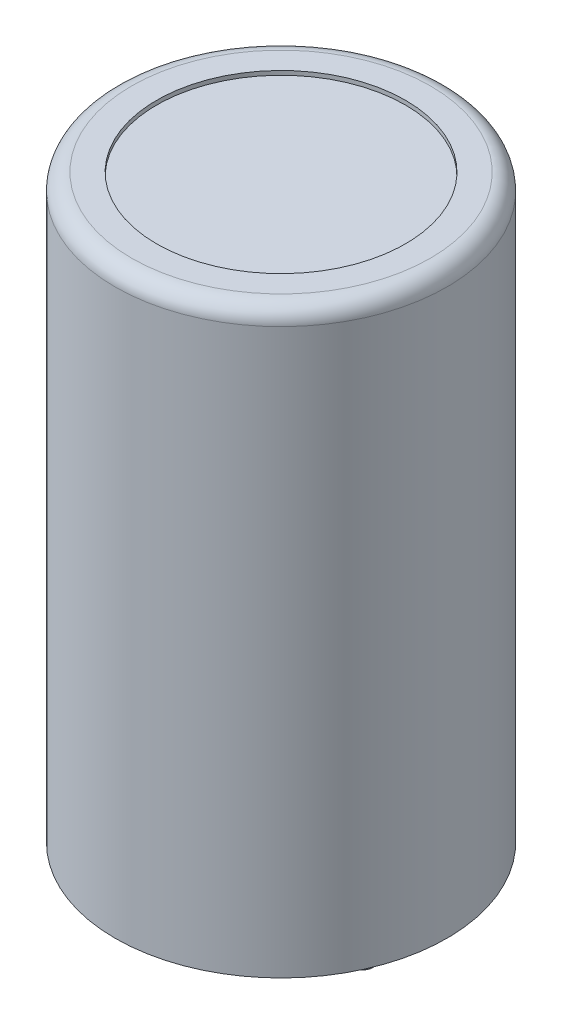
ISO-10303-21;
HEADER;
FILE_DESCRIPTION(('STEP AP214'),'2;1');
FILE_NAME('part.step','',(''),(''),'','','');
FILE_SCHEMA(('AUTOMOTIVE_DESIGN { 1 0 10303 214 1 1 1 1 }'));
ENDSEC;
DATA;
#1=APPLICATION_CONTEXT('core data for automotive mechanical design processes');
#2=APPLICATION_PROTOCOL_DEFINITION('international standard','automotive_design',2000,#1);
#3=PRODUCT_CONTEXT('',#1,'mechanical');
#4=PRODUCT('Part','Part','',(#3));
#5=PRODUCT_RELATED_PRODUCT_CATEGORY('part','',(#4));
#6=PRODUCT_DEFINITION_FORMATION('','',#4);
#7=PRODUCT_DEFINITION_CONTEXT('part definition',#1,'design');
#8=PRODUCT_DEFINITION('design','',#6,#7);
#9=PRODUCT_DEFINITION_SHAPE('','',#8);
#10=(LENGTH_UNIT() NAMED_UNIT(*) SI_UNIT(.MILLI.,.METRE.));
#11=(NAMED_UNIT(*) PLANE_ANGLE_UNIT() SI_UNIT($,.RADIAN.));
#12=(NAMED_UNIT(*) SI_UNIT($,.STERADIAN.) SOLID_ANGLE_UNIT());
#13=UNCERTAINTY_MEASURE_WITH_UNIT(LENGTH_MEASURE(1.E-05),#10,'distance_accuracy_value','');
#14=(GEOMETRIC_REPRESENTATION_CONTEXT(3) GLOBAL_UNCERTAINTY_ASSIGNED_CONTEXT((#13)) GLOBAL_UNIT_ASSIGNED_CONTEXT((#10,
#11,#12)) REPRESENTATION_CONTEXT('',''));
#15=CARTESIAN_POINT('',(0.,0.,0.));
#16=DIRECTION('',(0.,0.,1.));
#17=DIRECTION('',(1.,0.,0.));
#18=AXIS2_PLACEMENT_3D('',#15,#16,#17);
#19=CARTESIAN_POINT('',(0.,17.78,0.));
#20=DIRECTION('',(0.,-1.,0.));
#21=DIRECTION('',(0.,0.,-1.));
#22=AXIS2_PLACEMENT_3D('',#19,#20,#21);
#23=CYLINDRICAL_SURFACE('',#22,5.08);
#24=CARTESIAN_POINT('',(0.,17.272,0.));
#25=DIRECTION('',(0.,1.,0.));
#26=DIRECTION('',(0.,0.,1.));
#27=AXIS2_PLACEMENT_3D('',#24,#25,#26);
#28=CIRCLE('',#27,5.08);
#29=CARTESIAN_POINT('',(0.,17.272,5.08));
#30=VERTEX_POINT('',#29);
#31=EDGE_CURVE('E10',#30,#30,#28,.F.);
#32=ORIENTED_EDGE('',*,*,#31,.T.);
#33=EDGE_LOOP('',(#32));
#34=FACE_BOUND('',#33,.T.);
#35=CARTESIAN_POINT('',(0.,0.,0.));
#36=DIRECTION('',(0.,1.,0.));
#37=DIRECTION('',(0.,0.,1.));
#38=AXIS2_PLACEMENT_3D('',#35,#36,#37);
#39=CIRCLE('',#38,5.08);
#40=CARTESIAN_POINT('',(0.,0.,5.08));
#41=VERTEX_POINT('',#40);
#42=EDGE_CURVE('E53',#41,#41,#39,.T.);
#43=ORIENTED_EDGE('',*,*,#42,.T.);
#44=EDGE_LOOP('',(#43));
#45=FACE_BOUND('',#44,.T.);
#46=ADVANCED_FACE('F33',(#34,#45),#23,.T.);
#47=CARTESIAN_POINT('',(0.,17.78,0.));
#48=DIRECTION('',(0.,1.,0.));
#49=DIRECTION('',(0.,0.,1.));
#50=AXIS2_PLACEMENT_3D('',#47,#48,#49);
#51=PLANE('',#50);
#52=CARTESIAN_POINT('',(0.,17.78,0.));
#53=DIRECTION('',(0.,1.,0.));
#54=DIRECTION('',(0.,0.,1.));
#55=AXIS2_PLACEMENT_3D('',#52,#53,#54);
#56=CIRCLE('',#55,4.572);
#57=CARTESIAN_POINT('',(0.,17.78,4.572));
#58=VERTEX_POINT('',#57);
#59=EDGE_CURVE('E40',#58,#58,#56,.T.);
#60=ORIENTED_EDGE('',*,*,#59,.T.);
#61=EDGE_LOOP('',(#60));
#62=FACE_BOUND('',#61,.T.);
#63=CARTESIAN_POINT('',(0.,17.78,0.));
#64=DIRECTION('',(0.,1.,0.));
#65=DIRECTION('',(0.,0.,1.));
#66=AXIS2_PLACEMENT_3D('',#63,#64,#65);
#67=CIRCLE('',#66,3.81);
#68=CARTESIAN_POINT('',(0.,17.78,3.81));
#69=VERTEX_POINT('',#68);
#70=EDGE_CURVE('E63',#69,#69,#67,.T.);
#71=ORIENTED_EDGE('',*,*,#70,.F.);
#72=EDGE_LOOP('',(#71));
#73=FACE_BOUND('',#72,.T.);
#74=ADVANCED_FACE('F78',(#62,#73),#51,.T.);
#75=CARTESIAN_POINT('',(0.,0.,0.));
#76=DIRECTION('',(0.,1.,0.));
#77=DIRECTION('',(0.,0.,1.));
#78=AXIS2_PLACEMENT_3D('',#75,#76,#77);
#79=PLANE('',#78);
#80=CARTESIAN_POINT('',(2.5,0.,0.));
#81=DIRECTION('',(0.,1.,0.));
#82=DIRECTION('',(0.,0.,1.));
#83=AXIS2_PLACEMENT_3D('',#80,#81,#82);
#84=CIRCLE('',#83,0.3175);
#85=CARTESIAN_POINT('',(2.5,0.,0.3175));
#86=VERTEX_POINT('',#85);
#87=EDGE_CURVE('E44',#86,#86,#84,.F.);
#88=ORIENTED_EDGE('',*,*,#87,.F.);
#89=EDGE_LOOP('',(#88));
#90=FACE_BOUND('',#89,.T.);
#91=CARTESIAN_POINT('',(-2.5,0.,0.));
#92=DIRECTION('',(0.,1.,0.));
#93=DIRECTION('',(0.,0.,1.));
#94=AXIS2_PLACEMENT_3D('',#91,#92,#93);
#95=CIRCLE('',#94,0.3175);
#96=CARTESIAN_POINT('',(-2.5,0.,0.3175));
#97=VERTEX_POINT('',#96);
#98=EDGE_CURVE('E48',#97,#97,#95,.F.);
#99=ORIENTED_EDGE('',*,*,#98,.F.);
#100=EDGE_LOOP('',(#99));
#101=FACE_BOUND('',#100,.T.);
#102=ORIENTED_EDGE('',*,*,#42,.F.);
#103=EDGE_LOOP('',(#102));
#104=FACE_BOUND('',#103,.T.);
#105=ADVANCED_FACE('F80',(#90,#101,#104),#79,.F.);
#106=CARTESIAN_POINT('',(-2.5,-1.905,0.));
#107=DIRECTION('',(0.,1.,0.));
#108=DIRECTION('',(0.,0.,1.));
#109=AXIS2_PLACEMENT_3D('',#106,#107,#108);
#110=CYLINDRICAL_SURFACE('',#109,0.3175);
#111=CARTESIAN_POINT('',(-2.5,-1.905,0.));
#112=DIRECTION('',(0.,-1.,0.));
#113=DIRECTION('',(0.,0.,-1.));
#114=AXIS2_PLACEMENT_3D('',#111,#112,#113);
#115=CIRCLE('',#114,0.3175);
#116=CARTESIAN_POINT('',(-2.5,-1.905,-0.3175));
#117=VERTEX_POINT('',#116);
#118=EDGE_CURVE('E56',#117,#117,#115,.T.);
#119=ORIENTED_EDGE('',*,*,#118,.F.);
#120=EDGE_LOOP('',(#119));
#121=FACE_BOUND('',#120,.T.);
#122=ORIENTED_EDGE('',*,*,#98,.T.);
#123=EDGE_LOOP('',(#122));
#124=FACE_BOUND('',#123,.T.);
#125=ADVANCED_FACE('F86',(#121,#124),#110,.T.);
#126=CARTESIAN_POINT('',(-2.5,-1.905,0.));
#127=DIRECTION('',(0.,-1.,0.));
#128=DIRECTION('',(0.,0.,-1.));
#129=AXIS2_PLACEMENT_3D('',#126,#127,#128);
#130=PLANE('',#129);
#131=ORIENTED_EDGE('',*,*,#118,.T.);
#132=EDGE_LOOP('',(#131));
#133=FACE_BOUND('',#132,.T.);
#134=ADVANCED_FACE('F92',(#133),#130,.T.);
#135=CARTESIAN_POINT('',(2.5,-1.905,0.));
#136=DIRECTION('',(0.,1.,0.));
#137=DIRECTION('',(0.,0.,1.));
#138=AXIS2_PLACEMENT_3D('',#135,#136,#137);
#139=CYLINDRICAL_SURFACE('',#138,0.3175);
#140=CARTESIAN_POINT('',(2.5,-1.905,0.));
#141=DIRECTION('',(0.,-1.,0.));
#142=DIRECTION('',(0.,0.,-1.));
#143=AXIS2_PLACEMENT_3D('',#140,#141,#142);
#144=CIRCLE('',#143,0.3175);
#145=CARTESIAN_POINT('',(2.5,-1.905,-0.3175));
#146=VERTEX_POINT('',#145);
#147=EDGE_CURVE('E59',#146,#146,#144,.T.);
#148=ORIENTED_EDGE('',*,*,#147,.F.);
#149=EDGE_LOOP('',(#148));
#150=FACE_BOUND('',#149,.T.);
#151=ORIENTED_EDGE('',*,*,#87,.T.);
#152=EDGE_LOOP('',(#151));
#153=FACE_BOUND('',#152,.T.);
#154=ADVANCED_FACE('F96',(#150,#153),#139,.T.);
#155=CARTESIAN_POINT('',(2.5,-1.905,0.));
#156=DIRECTION('',(0.,-1.,0.));
#157=DIRECTION('',(0.,0.,-1.));
#158=AXIS2_PLACEMENT_3D('',#155,#156,#157);
#159=PLANE('',#158);
#160=ORIENTED_EDGE('',*,*,#147,.T.);
#161=EDGE_LOOP('',(#160));
#162=FACE_BOUND('',#161,.T.);
#163=ADVANCED_FACE('F74',(#162),#159,.T.);
#164=CARTESIAN_POINT('',(0.,17.653,0.));
#165=DIRECTION('',(0.,1.,0.));
#166=DIRECTION('',(0.,0.,1.));
#167=AXIS2_PLACEMENT_3D('',#164,#165,#166);
#168=CYLINDRICAL_SURFACE('',#167,3.81);
#169=CARTESIAN_POINT('',(0.,17.653,0.));
#170=DIRECTION('',(0.,1.,0.));
#171=DIRECTION('',(0.,0.,1.));
#172=AXIS2_PLACEMENT_3D('',#169,#170,#171);
#173=CIRCLE('',#172,3.81);
#174=CARTESIAN_POINT('',(0.,17.653,3.81));
#175=VERTEX_POINT('',#174);
#176=EDGE_CURVE('E62',#175,#175,#173,.T.);
#177=ORIENTED_EDGE('',*,*,#176,.F.);
#178=EDGE_LOOP('',(#177));
#179=FACE_BOUND('',#178,.T.);
#180=ORIENTED_EDGE('',*,*,#70,.T.);
#181=EDGE_LOOP('',(#180));
#182=FACE_BOUND('',#181,.T.);
#183=ADVANCED_FACE('F71',(#179,#182),#168,.F.);
#184=CARTESIAN_POINT('',(0.,17.653,0.));
#185=DIRECTION('',(0.,1.,0.));
#186=DIRECTION('',(0.,0.,1.));
#187=AXIS2_PLACEMENT_3D('',#184,#185,#186);
#188=PLANE('',#187);
#189=ORIENTED_EDGE('',*,*,#176,.T.);
#190=EDGE_LOOP('',(#189));
#191=FACE_BOUND('',#190,.T.);
#192=ADVANCED_FACE('F69',(#191),#188,.T.);
#193=CARTESIAN_POINT('',(0.,17.272,0.));
#194=DIRECTION('',(0.,1.,0.));
#195=DIRECTION('',(0.,0.,1.));
#196=AXIS2_PLACEMENT_3D('',#193,#194,#195);
#197=TOROIDAL_SURFACE('',#196,4.572,0.508);
#198=ORIENTED_EDGE('',*,*,#31,.F.);
#199=EDGE_LOOP('',(#198));
#200=FACE_BOUND('',#199,.T.);
#201=ORIENTED_EDGE('',*,*,#59,.F.);
#202=EDGE_LOOP('',(#201));
#203=FACE_BOUND('',#202,.T.);
#204=ADVANCED_FACE('F35',(#200,#203),#197,.T.);
#205=CLOSED_SHELL('',(#46,#74,#105,#125,#134,#154,#163,#183,#192,#204));
#206=MANIFOLD_SOLID_BREP('B2',#205);
#207=ADVANCED_BREP_SHAPE_REPRESENTATION('',(#18,#206),#14);
#208=SHAPE_DEFINITION_REPRESENTATION(#9,#207);
ENDSEC;
END-ISO-10303-21;
